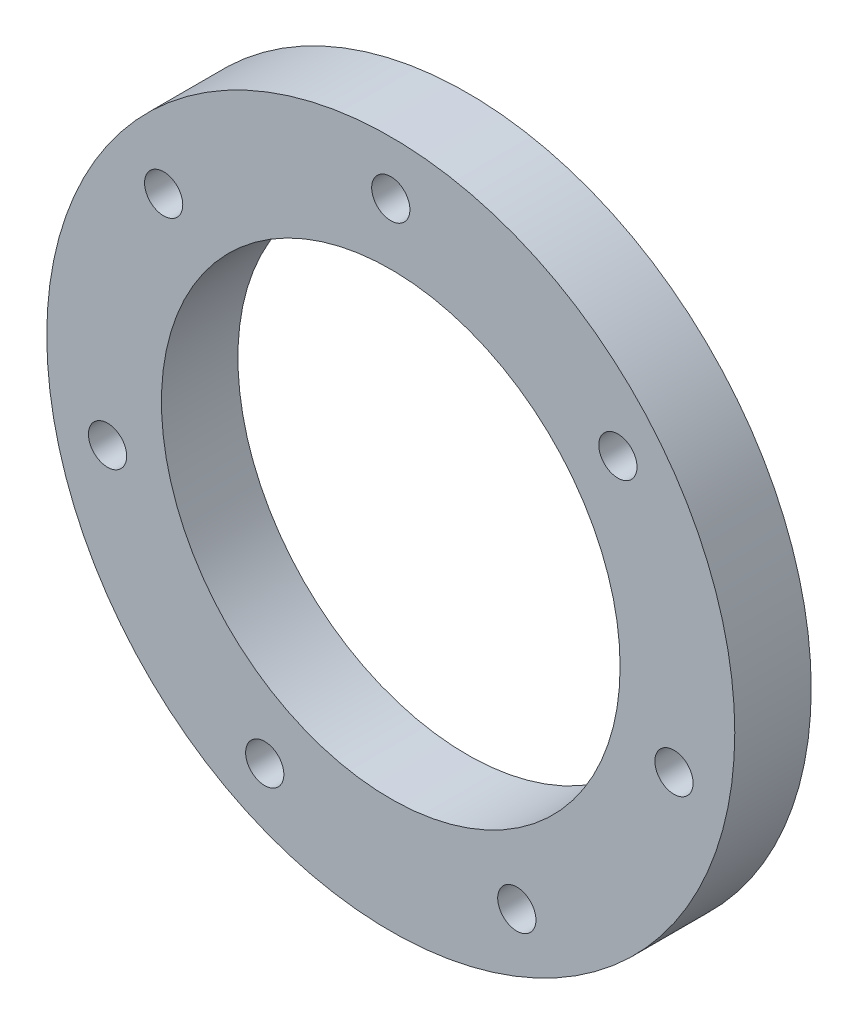
ISO-10303-21;
HEADER;
FILE_DESCRIPTION(('STEP AP214'),'2;1');
FILE_NAME('part.step','',(''),(''),'','','');
FILE_SCHEMA(('AUTOMOTIVE_DESIGN { 1 0 10303 214 1 1 1 1 }'));
ENDSEC;
DATA;
#1=APPLICATION_CONTEXT('core data for automotive mechanical design processes');
#2=APPLICATION_PROTOCOL_DEFINITION('international standard','automotive_design',2000,#1);
#3=PRODUCT_CONTEXT('',#1,'mechanical');
#4=PRODUCT('Part','Part','',(#3));
#5=PRODUCT_RELATED_PRODUCT_CATEGORY('part','',(#4));
#6=PRODUCT_DEFINITION_FORMATION('','',#4);
#7=PRODUCT_DEFINITION_CONTEXT('part definition',#1,'design');
#8=PRODUCT_DEFINITION('design','',#6,#7);
#9=PRODUCT_DEFINITION_SHAPE('','',#8);
#10=(LENGTH_UNIT() NAMED_UNIT(*) SI_UNIT(.MILLI.,.METRE.));
#11=(NAMED_UNIT(*) PLANE_ANGLE_UNIT() SI_UNIT($,.RADIAN.));
#12=(NAMED_UNIT(*) SI_UNIT($,.STERADIAN.) SOLID_ANGLE_UNIT());
#13=UNCERTAINTY_MEASURE_WITH_UNIT(LENGTH_MEASURE(1.E-05),#10,'distance_accuracy_value','');
#14=(GEOMETRIC_REPRESENTATION_CONTEXT(3) GLOBAL_UNCERTAINTY_ASSIGNED_CONTEXT((#13)) GLOBAL_UNIT_ASSIGNED_CONTEXT((#10,
#11,#12)) REPRESENTATION_CONTEXT('',''));
#15=CARTESIAN_POINT('',(0.,0.,0.));
#16=DIRECTION('',(0.,0.,1.));
#17=DIRECTION('',(1.,0.,0.));
#18=AXIS2_PLACEMENT_3D('',#15,#16,#17);
#19=CARTESIAN_POINT('',(0.,0.,5.));
#20=DIRECTION('',(0.,0.,1.));
#21=DIRECTION('',(1.,0.,0.));
#22=AXIS2_PLACEMENT_3D('',#19,#20,#21);
#23=PLANE('',#22);
#24=CARTESIAN_POINT('',(-8.24379104323223,-17.1184084901463,5.));
#25=DIRECTION('',(0.,0.,1.));
#26=DIRECTION('',(1.,0.,0.));
#27=AXIS2_PLACEMENT_3D('',#24,#25,#26);
#28=CIRCLE('',#27,1.25000000000021);
#29=CARTESIAN_POINT('',(-6.99379104323203,-17.1184084901463,5.));
#30=VERTEX_POINT('',#29);
#31=EDGE_CURVE('E103',#30,#30,#28,.T.);
#32=ORIENTED_EDGE('',*,*,#31,.F.);
#33=EDGE_LOOP('',(#32));
#34=FACE_BOUND('',#33,.T.);
#35=CARTESIAN_POINT('',(18.5236303314554,-4.22789774516939,5.));
#36=DIRECTION('',(0.,0.,1.));
#37=DIRECTION('',(1.,0.,0.));
#38=AXIS2_PLACEMENT_3D('',#35,#36,#37);
#39=CIRCLE('',#38,1.25);
#40=CARTESIAN_POINT('',(19.7736303314554,-4.22789774516939,5.));
#41=VERTEX_POINT('',#40);
#42=EDGE_CURVE('E107',#41,#41,#39,.T.);
#43=ORIENTED_EDGE('',*,*,#42,.F.);
#44=EDGE_LOOP('',(#43));
#45=FACE_BOUND('',#44,.T.);
#46=CARTESIAN_POINT('',(-14.8547981668923,11.8463062353154,5.));
#47=DIRECTION('',(0.,0.,1.));
#48=DIRECTION('',(1.,0.,0.));
#49=AXIS2_PLACEMENT_3D('',#46,#47,#48);
#50=CIRCLE('',#49,1.25000000000064);
#51=CARTESIAN_POINT('',(-13.6047981668917,11.8463062353154,5.));
#52=VERTEX_POINT('',#51);
#53=EDGE_CURVE('E69',#52,#52,#50,.T.);
#54=ORIENTED_EDGE('',*,*,#53,.F.);
#55=EDGE_LOOP('',(#54));
#56=FACE_BOUND('',#55,.T.);
#57=CARTESIAN_POINT('',(0.,19.,5.));
#58=DIRECTION('',(0.,0.,1.));
#59=DIRECTION('',(1.,0.,0.));
#60=AXIS2_PLACEMENT_3D('',#57,#58,#59);
#61=CIRCLE('',#60,1.25);
#62=CARTESIAN_POINT('',(1.25,19.,5.));
#63=VERTEX_POINT('',#62);
#64=EDGE_CURVE('E48',#63,#63,#61,.T.);
#65=ORIENTED_EDGE('',*,*,#64,.F.);
#66=EDGE_LOOP('',(#65));
#67=FACE_BOUND('',#66,.T.);
#68=CARTESIAN_POINT('',(0.,0.,5.));
#69=DIRECTION('',(0.,0.,1.));
#70=DIRECTION('',(1.,0.,0.));
#71=AXIS2_PLACEMENT_3D('',#68,#69,#70);
#72=CIRCLE('',#71,22.5);
#73=CARTESIAN_POINT('',(22.5,0.,5.));
#74=VERTEX_POINT('',#73);
#75=EDGE_CURVE('E11',#74,#74,#72,.T.);
#76=ORIENTED_EDGE('',*,*,#75,.T.);
#77=EDGE_LOOP('',(#76));
#78=FACE_BOUND('',#77,.T.);
#79=CARTESIAN_POINT('',(0.,0.,5.));
#80=DIRECTION('',(0.,0.,1.));
#81=DIRECTION('',(1.,0.,0.));
#82=AXIS2_PLACEMENT_3D('',#79,#80,#81);
#83=CIRCLE('',#82,15.);
#84=CARTESIAN_POINT('',(15.,0.,5.));
#85=VERTEX_POINT('',#84);
#86=EDGE_CURVE('E60',#85,#85,#83,.T.);
#87=ORIENTED_EDGE('',*,*,#86,.F.);
#88=EDGE_LOOP('',(#87));
#89=FACE_BOUND('',#88,.T.);
#90=CARTESIAN_POINT('',(14.854798166893,11.8463062353164,5.));
#91=DIRECTION('',(0.,0.,1.));
#92=DIRECTION('',(1.,0.,0.));
#93=AXIS2_PLACEMENT_3D('',#90,#91,#92);
#94=CIRCLE('',#93,1.25);
#95=CARTESIAN_POINT('',(16.104798166893,11.8463062353164,5.));
#96=VERTEX_POINT('',#95);
#97=EDGE_CURVE('E117',#96,#96,#94,.T.);
#98=ORIENTED_EDGE('',*,*,#97,.F.);
#99=EDGE_LOOP('',(#98));
#100=FACE_BOUND('',#99,.T.);
#101=CARTESIAN_POINT('',(8.24379104323457,-17.1184084901455,5.));
#102=DIRECTION('',(0.,0.,1.));
#103=DIRECTION('',(1.,0.,0.));
#104=AXIS2_PLACEMENT_3D('',#101,#102,#103);
#105=CIRCLE('',#104,1.25);
#106=CARTESIAN_POINT('',(9.49379104323457,-17.1184084901455,5.));
#107=VERTEX_POINT('',#106);
#108=EDGE_CURVE('E121',#107,#107,#105,.T.);
#109=ORIENTED_EDGE('',*,*,#108,.F.);
#110=EDGE_LOOP('',(#109));
#111=FACE_BOUND('',#110,.T.);
#112=CARTESIAN_POINT('',(-18.5236303314538,-4.22789774517068,5.));
#113=DIRECTION('',(0.,0.,1.));
#114=DIRECTION('',(1.,0.,0.));
#115=AXIS2_PLACEMENT_3D('',#112,#113,#114);
#116=CIRCLE('',#115,1.25000000000046);
#117=CARTESIAN_POINT('',(-17.2736303314533,-4.22789774517068,5.));
#118=VERTEX_POINT('',#117);
#119=EDGE_CURVE('E124',#118,#118,#116,.T.);
#120=ORIENTED_EDGE('',*,*,#119,.F.);
#121=EDGE_LOOP('',(#120));
#122=FACE_BOUND('',#121,.T.);
#123=ADVANCED_FACE('F34',(#34,#45,#56,#67,#78,#89,#100,#111,#122),#23,.T.);
#124=CARTESIAN_POINT('',(0.,0.,0.));
#125=DIRECTION('',(0.,0.,1.));
#126=DIRECTION('',(1.,0.,0.));
#127=AXIS2_PLACEMENT_3D('',#124,#125,#126);
#128=PLANE('',#127);
#129=CARTESIAN_POINT('',(0.,0.,0.));
#130=DIRECTION('',(0.,0.,1.));
#131=DIRECTION('',(1.,0.,0.));
#132=AXIS2_PLACEMENT_3D('',#129,#130,#131);
#133=CIRCLE('',#132,22.5);
#134=CARTESIAN_POINT('',(22.5,0.,0.));
#135=VERTEX_POINT('',#134);
#136=EDGE_CURVE('E38',#135,#135,#133,.T.);
#137=ORIENTED_EDGE('',*,*,#136,.F.);
#138=EDGE_LOOP('',(#137));
#139=FACE_BOUND('',#138,.T.);
#140=CARTESIAN_POINT('',(0.,19.,0.));
#141=DIRECTION('',(0.,0.,1.));
#142=DIRECTION('',(1.,0.,0.));
#143=AXIS2_PLACEMENT_3D('',#140,#141,#142);
#144=CIRCLE('',#143,1.25);
#145=CARTESIAN_POINT('',(1.25,19.,0.));
#146=VERTEX_POINT('',#145);
#147=EDGE_CURVE('E51',#146,#146,#144,.T.);
#148=ORIENTED_EDGE('',*,*,#147,.T.);
#149=EDGE_LOOP('',(#148));
#150=FACE_BOUND('',#149,.T.);
#151=CARTESIAN_POINT('',(0.,0.,0.));
#152=DIRECTION('',(0.,0.,1.));
#153=DIRECTION('',(1.,0.,0.));
#154=AXIS2_PLACEMENT_3D('',#151,#152,#153);
#155=CIRCLE('',#154,15.);
#156=CARTESIAN_POINT('',(15.,0.,0.));
#157=VERTEX_POINT('',#156);
#158=EDGE_CURVE('E65',#157,#157,#155,.T.);
#159=ORIENTED_EDGE('',*,*,#158,.T.);
#160=EDGE_LOOP('',(#159));
#161=FACE_BOUND('',#160,.T.);
#162=CARTESIAN_POINT('',(-14.8547981668923,11.8463062353154,0.));
#163=DIRECTION('',(0.,0.,1.));
#164=DIRECTION('',(1.,0.,0.));
#165=AXIS2_PLACEMENT_3D('',#162,#163,#164);
#166=CIRCLE('',#165,1.25000000000064);
#167=CARTESIAN_POINT('',(-13.6047981668917,11.8463062353154,0.));
#168=VERTEX_POINT('',#167);
#169=EDGE_CURVE('E66',#168,#168,#166,.T.);
#170=ORIENTED_EDGE('',*,*,#169,.T.);
#171=EDGE_LOOP('',(#170));
#172=FACE_BOUND('',#171,.T.);
#173=CARTESIAN_POINT('',(14.854798166893,11.8463062353164,0.));
#174=DIRECTION('',(0.,0.,1.));
#175=DIRECTION('',(1.,0.,0.));
#176=AXIS2_PLACEMENT_3D('',#173,#174,#175);
#177=CIRCLE('',#176,1.25);
#178=CARTESIAN_POINT('',(16.104798166893,11.8463062353164,0.));
#179=VERTEX_POINT('',#178);
#180=EDGE_CURVE('E147',#179,#179,#177,.T.);
#181=ORIENTED_EDGE('',*,*,#180,.T.);
#182=EDGE_LOOP('',(#181));
#183=FACE_BOUND('',#182,.T.);
#184=CARTESIAN_POINT('',(18.5236303314554,-4.22789774516939,0.));
#185=DIRECTION('',(0.,0.,1.));
#186=DIRECTION('',(1.,0.,0.));
#187=AXIS2_PLACEMENT_3D('',#184,#185,#186);
#188=CIRCLE('',#187,1.25);
#189=CARTESIAN_POINT('',(19.7736303314554,-4.22789774516939,0.));
#190=VERTEX_POINT('',#189);
#191=EDGE_CURVE('E148',#190,#190,#188,.T.);
#192=ORIENTED_EDGE('',*,*,#191,.T.);
#193=EDGE_LOOP('',(#192));
#194=FACE_BOUND('',#193,.T.);
#195=CARTESIAN_POINT('',(8.24379104323457,-17.1184084901455,0.));
#196=DIRECTION('',(0.,0.,1.));
#197=DIRECTION('',(1.,0.,0.));
#198=AXIS2_PLACEMENT_3D('',#195,#196,#197);
#199=CIRCLE('',#198,1.25);
#200=CARTESIAN_POINT('',(9.49379104323457,-17.1184084901455,0.));
#201=VERTEX_POINT('',#200);
#202=EDGE_CURVE('E138',#201,#201,#199,.T.);
#203=ORIENTED_EDGE('',*,*,#202,.T.);
#204=EDGE_LOOP('',(#203));
#205=FACE_BOUND('',#204,.T.);
#206=CARTESIAN_POINT('',(-8.24379104323223,-17.1184084901463,0.));
#207=DIRECTION('',(0.,0.,1.));
#208=DIRECTION('',(1.,0.,0.));
#209=AXIS2_PLACEMENT_3D('',#206,#207,#208);
#210=CIRCLE('',#209,1.25000000000021);
#211=CARTESIAN_POINT('',(-6.99379104323203,-17.1184084901463,0.));
#212=VERTEX_POINT('',#211);
#213=EDGE_CURVE('E127',#212,#212,#210,.T.);
#214=ORIENTED_EDGE('',*,*,#213,.T.);
#215=EDGE_LOOP('',(#214));
#216=FACE_BOUND('',#215,.T.);
#217=CARTESIAN_POINT('',(-18.5236303314538,-4.22789774517068,0.));
#218=DIRECTION('',(0.,0.,1.));
#219=DIRECTION('',(1.,0.,0.));
#220=AXIS2_PLACEMENT_3D('',#217,#218,#219);
#221=CIRCLE('',#220,1.25000000000046);
#222=CARTESIAN_POINT('',(-17.2736303314533,-4.22789774517068,0.));
#223=VERTEX_POINT('',#222);
#224=EDGE_CURVE('E128',#223,#223,#221,.T.);
#225=ORIENTED_EDGE('',*,*,#224,.T.);
#226=EDGE_LOOP('',(#225));
#227=FACE_BOUND('',#226,.T.);
#228=ADVANCED_FACE('F78',(#139,#150,#161,#172,#183,#194,#205,#216,#227),#128,.F.);
#229=CARTESIAN_POINT('',(0.,0.,5.));
#230=DIRECTION('',(0.,0.,-1.));
#231=DIRECTION('',(-1.,0.,0.));
#232=AXIS2_PLACEMENT_3D('',#229,#230,#231);
#233=CYLINDRICAL_SURFACE('',#232,22.5);
#234=ORIENTED_EDGE('',*,*,#75,.F.);
#235=EDGE_LOOP('',(#234));
#236=FACE_BOUND('',#235,.T.);
#237=ORIENTED_EDGE('',*,*,#136,.T.);
#238=EDGE_LOOP('',(#237));
#239=FACE_BOUND('',#238,.T.);
#240=ADVANCED_FACE('F36',(#236,#239),#233,.T.);
#241=CARTESIAN_POINT('',(0.,19.,5.));
#242=DIRECTION('',(0.,0.,-1.));
#243=DIRECTION('',(-1.,0.,0.));
#244=AXIS2_PLACEMENT_3D('',#241,#242,#243);
#245=CYLINDRICAL_SURFACE('',#244,1.25);
#246=ORIENTED_EDGE('',*,*,#64,.T.);
#247=EDGE_LOOP('',(#246));
#248=FACE_BOUND('',#247,.T.);
#249=ORIENTED_EDGE('',*,*,#147,.F.);
#250=EDGE_LOOP('',(#249));
#251=FACE_BOUND('',#250,.T.);
#252=ADVANCED_FACE('F81',(#248,#251),#245,.F.);
#253=CARTESIAN_POINT('',(0.,0.,5.));
#254=DIRECTION('',(0.,0.,-1.));
#255=DIRECTION('',(-1.,0.,0.));
#256=AXIS2_PLACEMENT_3D('',#253,#254,#255);
#257=CYLINDRICAL_SURFACE('',#256,15.);
#258=ORIENTED_EDGE('',*,*,#86,.T.);
#259=EDGE_LOOP('',(#258));
#260=FACE_BOUND('',#259,.T.);
#261=ORIENTED_EDGE('',*,*,#158,.F.);
#262=EDGE_LOOP('',(#261));
#263=FACE_BOUND('',#262,.T.);
#264=ADVANCED_FACE('F83',(#260,#263),#257,.F.);
#265=CARTESIAN_POINT('',(-14.8547981668923,11.8463062353154,5.));
#266=DIRECTION('',(0.,0.,-1.));
#267=DIRECTION('',(-1.,0.,0.));
#268=AXIS2_PLACEMENT_3D('',#265,#266,#267);
#269=CYLINDRICAL_SURFACE('',#268,1.25000000000064);
#270=ORIENTED_EDGE('',*,*,#53,.T.);
#271=EDGE_LOOP('',(#270));
#272=FACE_BOUND('',#271,.T.);
#273=ORIENTED_EDGE('',*,*,#169,.F.);
#274=EDGE_LOOP('',(#273));
#275=FACE_BOUND('',#274,.T.);
#276=ADVANCED_FACE('F89',(#272,#275),#269,.F.);
#277=CARTESIAN_POINT('',(14.854798166893,11.8463062353164,5.));
#278=DIRECTION('',(0.,0.,-1.));
#279=DIRECTION('',(-1.,0.,0.));
#280=AXIS2_PLACEMENT_3D('',#277,#278,#279);
#281=CYLINDRICAL_SURFACE('',#280,1.25);
#282=ORIENTED_EDGE('',*,*,#97,.T.);
#283=EDGE_LOOP('',(#282));
#284=FACE_BOUND('',#283,.T.);
#285=ORIENTED_EDGE('',*,*,#180,.F.);
#286=EDGE_LOOP('',(#285));
#287=FACE_BOUND('',#286,.T.);
#288=ADVANCED_FACE('F162',(#284,#287),#281,.F.);
#289=CARTESIAN_POINT('',(18.5236303314554,-4.22789774516939,5.));
#290=DIRECTION('',(0.,0.,-1.));
#291=DIRECTION('',(-1.,0.,0.));
#292=AXIS2_PLACEMENT_3D('',#289,#290,#291);
#293=CYLINDRICAL_SURFACE('',#292,1.25);
#294=ORIENTED_EDGE('',*,*,#42,.T.);
#295=EDGE_LOOP('',(#294));
#296=FACE_BOUND('',#295,.T.);
#297=ORIENTED_EDGE('',*,*,#191,.F.);
#298=EDGE_LOOP('',(#297));
#299=FACE_BOUND('',#298,.T.);
#300=ADVANCED_FACE('F167',(#296,#299),#293,.F.);
#301=CARTESIAN_POINT('',(8.24379104323457,-17.1184084901455,5.));
#302=DIRECTION('',(0.,0.,-1.));
#303=DIRECTION('',(-1.,0.,0.));
#304=AXIS2_PLACEMENT_3D('',#301,#302,#303);
#305=CYLINDRICAL_SURFACE('',#304,1.25);
#306=ORIENTED_EDGE('',*,*,#108,.T.);
#307=EDGE_LOOP('',(#306));
#308=FACE_BOUND('',#307,.T.);
#309=ORIENTED_EDGE('',*,*,#202,.F.);
#310=EDGE_LOOP('',(#309));
#311=FACE_BOUND('',#310,.T.);
#312=ADVANCED_FACE('F173',(#308,#311),#305,.F.);
#313=CARTESIAN_POINT('',(-8.24379104323223,-17.1184084901463,5.));
#314=DIRECTION('',(0.,0.,-1.));
#315=DIRECTION('',(-1.,0.,0.));
#316=AXIS2_PLACEMENT_3D('',#313,#314,#315);
#317=CYLINDRICAL_SURFACE('',#316,1.25000000000021);
#318=ORIENTED_EDGE('',*,*,#31,.T.);
#319=EDGE_LOOP('',(#318));
#320=FACE_BOUND('',#319,.T.);
#321=ORIENTED_EDGE('',*,*,#213,.F.);
#322=EDGE_LOOP('',(#321));
#323=FACE_BOUND('',#322,.T.);
#324=ADVANCED_FACE('F177',(#320,#323),#317,.F.);
#325=CARTESIAN_POINT('',(-18.5236303314538,-4.22789774517068,5.));
#326=DIRECTION('',(0.,0.,-1.));
#327=DIRECTION('',(-1.,0.,0.));
#328=AXIS2_PLACEMENT_3D('',#325,#326,#327);
#329=CYLINDRICAL_SURFACE('',#328,1.25000000000046);
#330=ORIENTED_EDGE('',*,*,#119,.T.);
#331=EDGE_LOOP('',(#330));
#332=FACE_BOUND('',#331,.T.);
#333=ORIENTED_EDGE('',*,*,#224,.F.);
#334=EDGE_LOOP('',(#333));
#335=FACE_BOUND('',#334,.T.);
#336=ADVANCED_FACE('F181',(#332,#335),#329,.F.);
#337=CLOSED_SHELL('',(#123,#228,#240,#252,#264,#276,#288,#300,#312,#324,#336));
#338=MANIFOLD_SOLID_BREP('B2',#337);
#339=ADVANCED_BREP_SHAPE_REPRESENTATION('',(#18,#338),#14);
#340=SHAPE_DEFINITION_REPRESENTATION(#9,#339);
ENDSEC;
END-ISO-10303-21;
